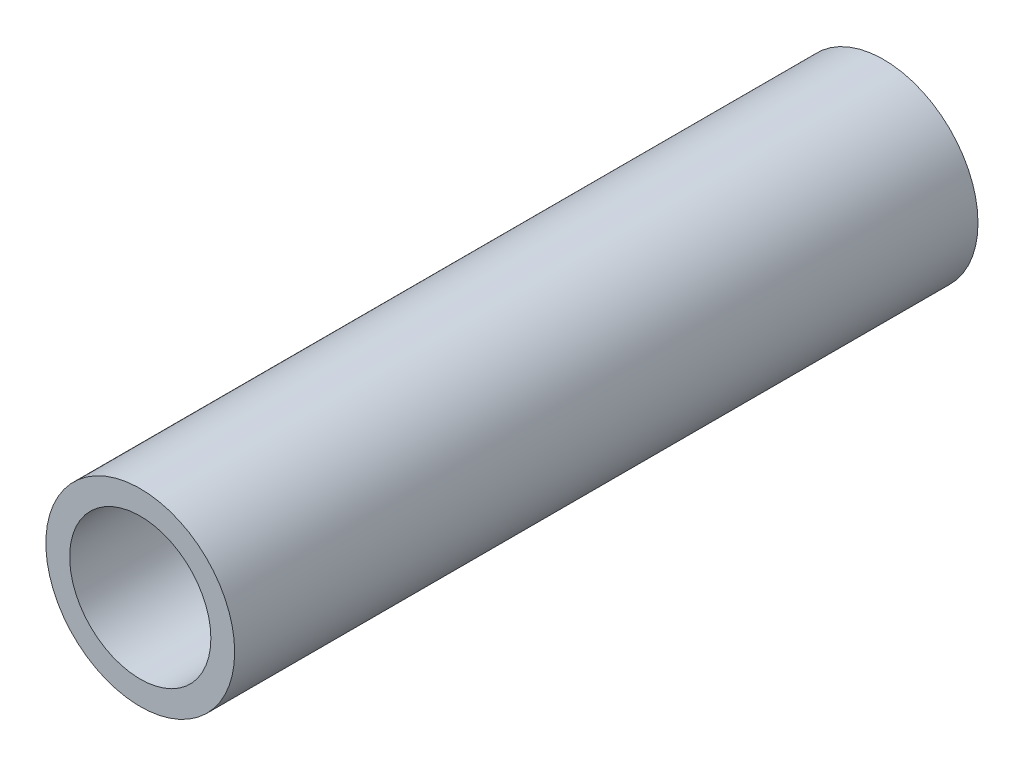
ISO-10303-21;
HEADER;
FILE_DESCRIPTION(('STEP AP214'),'2;1');
FILE_NAME('part.step','',(''),(''),'','','');
FILE_SCHEMA(('AUTOMOTIVE_DESIGN { 1 0 10303 214 1 1 1 1 }'));
ENDSEC;
DATA;
#1=APPLICATION_CONTEXT('core data for automotive mechanical design processes');
#2=APPLICATION_PROTOCOL_DEFINITION('international standard','automotive_design',2000,#1);
#3=PRODUCT_CONTEXT('',#1,'mechanical');
#4=PRODUCT('Part','Part','',(#3));
#5=PRODUCT_RELATED_PRODUCT_CATEGORY('part','',(#4));
#6=PRODUCT_DEFINITION_FORMATION('','',#4);
#7=PRODUCT_DEFINITION_CONTEXT('part definition',#1,'design');
#8=PRODUCT_DEFINITION('design','',#6,#7);
#9=PRODUCT_DEFINITION_SHAPE('','',#8);
#10=(LENGTH_UNIT() NAMED_UNIT(*) SI_UNIT(.MILLI.,.METRE.));
#11=(NAMED_UNIT(*) PLANE_ANGLE_UNIT() SI_UNIT($,.RADIAN.));
#12=(NAMED_UNIT(*) SI_UNIT($,.STERADIAN.) SOLID_ANGLE_UNIT());
#13=UNCERTAINTY_MEASURE_WITH_UNIT(LENGTH_MEASURE(1.E-05),#10,'distance_accuracy_value','');
#14=(GEOMETRIC_REPRESENTATION_CONTEXT(3) GLOBAL_UNCERTAINTY_ASSIGNED_CONTEXT((#13)) GLOBAL_UNIT_ASSIGNED_CONTEXT((#10,
#11,#12)) REPRESENTATION_CONTEXT('',''));
#15=CARTESIAN_POINT('',(0.,0.,0.));
#16=DIRECTION('',(0.,0.,1.));
#17=DIRECTION('',(1.,0.,0.));
#18=AXIS2_PLACEMENT_3D('',#15,#16,#17);
#19=CARTESIAN_POINT('',(0.,0.,50.));
#20=DIRECTION('',(0.,0.,1.));
#21=DIRECTION('',(1.,0.,0.));
#22=AXIS2_PLACEMENT_3D('',#19,#20,#21);
#23=PLANE('',#22);
#24=CARTESIAN_POINT('',(0.,0.,50.));
#25=DIRECTION('',(0.,0.,1.));
#26=DIRECTION('',(1.,0.,0.));
#27=AXIS2_PLACEMENT_3D('',#24,#25,#26);
#28=CIRCLE('',#27,12.7);
#29=CARTESIAN_POINT('',(12.7,0.,50.));
#30=VERTEX_POINT('',#29);
#31=EDGE_CURVE('E10',#30,#30,#28,.T.);
#32=ORIENTED_EDGE('',*,*,#31,.T.);
#33=EDGE_LOOP('',(#32));
#34=FACE_BOUND('',#33,.T.);
#35=CARTESIAN_POINT('',(0.,0.,50.));
#36=DIRECTION('',(0.,0.,1.));
#37=DIRECTION('',(1.,0.,0.));
#38=AXIS2_PLACEMENT_3D('',#35,#36,#37);
#39=CIRCLE('',#38,9.5);
#40=CARTESIAN_POINT('',(9.5,0.,50.));
#41=VERTEX_POINT('',#40);
#42=EDGE_CURVE('E42',#41,#41,#39,.T.);
#43=ORIENTED_EDGE('',*,*,#42,.F.);
#44=EDGE_LOOP('',(#43));
#45=FACE_BOUND('',#44,.T.);
#46=ADVANCED_FACE('F31',(#34,#45),#23,.T.);
#47=CARTESIAN_POINT('',(0.,0.,-50.));
#48=DIRECTION('',(0.,0.,1.));
#49=DIRECTION('',(1.,0.,0.));
#50=AXIS2_PLACEMENT_3D('',#47,#48,#49);
#51=PLANE('',#50);
#52=CARTESIAN_POINT('',(0.,0.,-50.));
#53=DIRECTION('',(0.,0.,1.));
#54=DIRECTION('',(1.,0.,0.));
#55=AXIS2_PLACEMENT_3D('',#52,#53,#54);
#56=CIRCLE('',#55,12.7);
#57=CARTESIAN_POINT('',(12.7,0.,-50.));
#58=VERTEX_POINT('',#57);
#59=EDGE_CURVE('E35',#58,#58,#56,.T.);
#60=ORIENTED_EDGE('',*,*,#59,.F.);
#61=EDGE_LOOP('',(#60));
#62=FACE_BOUND('',#61,.T.);
#63=CARTESIAN_POINT('',(0.,0.,-50.));
#64=DIRECTION('',(0.,0.,1.));
#65=DIRECTION('',(1.,0.,0.));
#66=AXIS2_PLACEMENT_3D('',#63,#64,#65);
#67=CIRCLE('',#66,9.5);
#68=CARTESIAN_POINT('',(9.5,0.,-50.));
#69=VERTEX_POINT('',#68);
#70=EDGE_CURVE('E44',#69,#69,#67,.T.);
#71=ORIENTED_EDGE('',*,*,#70,.T.);
#72=EDGE_LOOP('',(#71));
#73=FACE_BOUND('',#72,.T.);
#74=ADVANCED_FACE('F54',(#62,#73),#51,.F.);
#75=CARTESIAN_POINT('',(0.,0.,50.));
#76=DIRECTION('',(0.,0.,-1.));
#77=DIRECTION('',(-1.,0.,0.));
#78=AXIS2_PLACEMENT_3D('',#75,#76,#77);
#79=CYLINDRICAL_SURFACE('',#78,12.7);
#80=ORIENTED_EDGE('',*,*,#31,.F.);
#81=EDGE_LOOP('',(#80));
#82=FACE_BOUND('',#81,.T.);
#83=ORIENTED_EDGE('',*,*,#59,.T.);
#84=EDGE_LOOP('',(#83));
#85=FACE_BOUND('',#84,.T.);
#86=ADVANCED_FACE('F33',(#82,#85),#79,.T.);
#87=CARTESIAN_POINT('',(0.,0.,50.));
#88=DIRECTION('',(0.,0.,-1.));
#89=DIRECTION('',(-1.,0.,0.));
#90=AXIS2_PLACEMENT_3D('',#87,#88,#89);
#91=CYLINDRICAL_SURFACE('',#90,9.5);
#92=ORIENTED_EDGE('',*,*,#42,.T.);
#93=EDGE_LOOP('',(#92));
#94=FACE_BOUND('',#93,.T.);
#95=ORIENTED_EDGE('',*,*,#70,.F.);
#96=EDGE_LOOP('',(#95));
#97=FACE_BOUND('',#96,.T.);
#98=ADVANCED_FACE('F50',(#94,#97),#91,.F.);
#99=CLOSED_SHELL('',(#46,#74,#86,#98));
#100=MANIFOLD_SOLID_BREP('B2',#99);
#101=ADVANCED_BREP_SHAPE_REPRESENTATION('',(#18,#100),#14);
#102=SHAPE_DEFINITION_REPRESENTATION(#9,#101);
ENDSEC;
END-ISO-10303-21;
